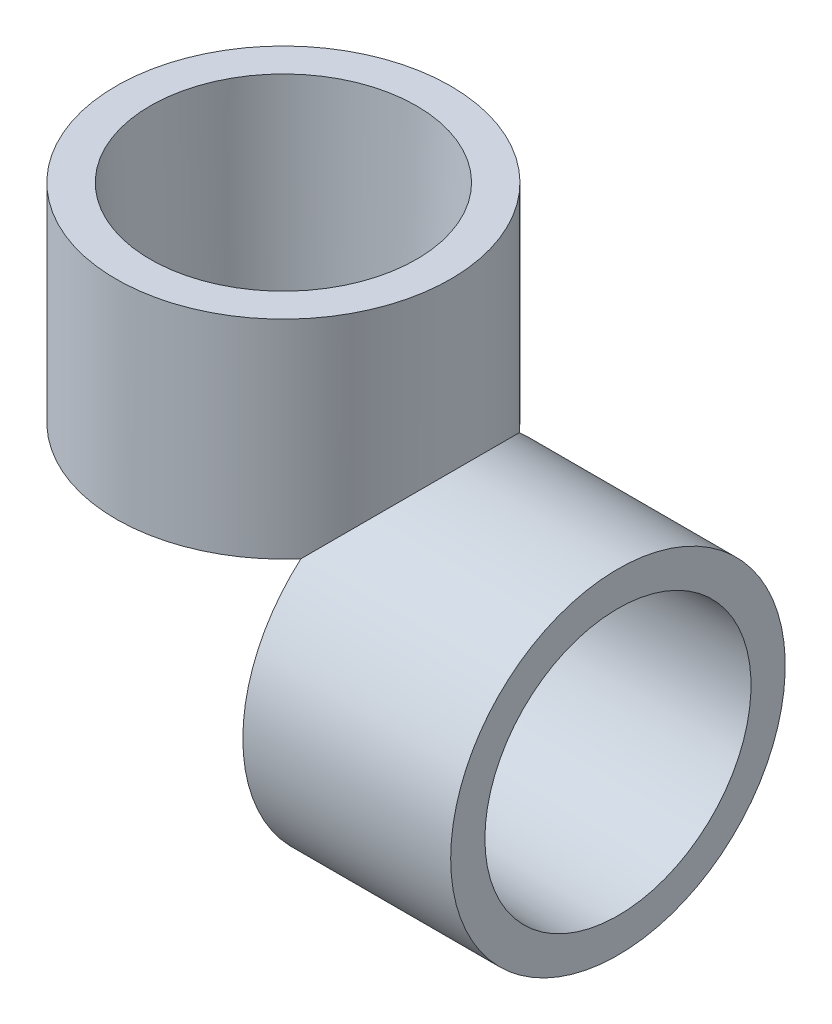
ISO-10303-21;
HEADER;
FILE_DESCRIPTION(('STEP AP214'),'2;1');
FILE_NAME('part.step','',(''),(''),'','','');
FILE_SCHEMA(('AUTOMOTIVE_DESIGN { 1 0 10303 214 1 1 1 1 }'));
ENDSEC;
DATA;
#1=APPLICATION_CONTEXT('core data for automotive mechanical design processes');
#2=APPLICATION_PROTOCOL_DEFINITION('international standard','automotive_design',2000,#1);
#3=PRODUCT_CONTEXT('',#1,'mechanical');
#4=PRODUCT('Part','Part','',(#3));
#5=PRODUCT_RELATED_PRODUCT_CATEGORY('part','',(#4));
#6=PRODUCT_DEFINITION_FORMATION('','',#4);
#7=PRODUCT_DEFINITION_CONTEXT('part definition',#1,'design');
#8=PRODUCT_DEFINITION('design','',#6,#7);
#9=PRODUCT_DEFINITION_SHAPE('','',#8);
#10=(LENGTH_UNIT() NAMED_UNIT(*) SI_UNIT(.MILLI.,.METRE.));
#11=(NAMED_UNIT(*) PLANE_ANGLE_UNIT() SI_UNIT($,.RADIAN.));
#12=(NAMED_UNIT(*) SI_UNIT($,.STERADIAN.) SOLID_ANGLE_UNIT());
#13=UNCERTAINTY_MEASURE_WITH_UNIT(LENGTH_MEASURE(1.E-05),#10,'distance_accuracy_value','');
#14=(GEOMETRIC_REPRESENTATION_CONTEXT(3) GLOBAL_UNCERTAINTY_ASSIGNED_CONTEXT((#13)) GLOBAL_UNIT_ASSIGNED_CONTEXT((#10,
#11,#12)) REPRESENTATION_CONTEXT('',''));
#15=CARTESIAN_POINT('',(0.,0.,0.));
#16=DIRECTION('',(0.,0.,1.));
#17=DIRECTION('',(1.,0.,0.));
#18=AXIS2_PLACEMENT_3D('',#15,#16,#17);
#19=CARTESIAN_POINT('',(-22.4023663910288,0.,0.));
#20=DIRECTION('',(-1.,0.,0.));
#21=DIRECTION('',(0.,0.,1.));
#22=AXIS2_PLACEMENT_3D('',#19,#20,#21);
#23=CYLINDRICAL_SURFACE('',#22,16.764);
#24=CARTESIAN_POINT('',(33.528,0.,0.));
#25=DIRECTION('',(-1.,0.,0.));
#26=DIRECTION('',(0.,0.,1.));
#27=AXIS2_PLACEMENT_3D('',#24,#25,#26);
#28=CIRCLE('',#27,16.764);
#29=CARTESIAN_POINT('',(33.528,0.,16.764));
#30=VERTEX_POINT('',#29);
#31=EDGE_CURVE('E77',#30,#30,#28,.T.);
#32=ORIENTED_EDGE('',*,*,#31,.T.);
#33=EDGE_LOOP('',(#32));
#34=FACE_BOUND('',#33,.T.);
#35=CARTESIAN_POINT('',(12.7,0.,0.));
#36=DIRECTION('',(-1.,0.,0.));
#37=DIRECTION('',(0.,0.,1.));
#38=AXIS2_PLACEMENT_3D('',#35,#36,#37);
#39=CIRCLE('',#38,16.764);
#40=CARTESIAN_POINT('',(12.7,12.7,-10.9426548880973));
#41=VERTEX_POINT('',#40);
#42=CARTESIAN_POINT('',(12.7,12.7,10.9426548880973));
#43=VERTEX_POINT('',#42);
#44=EDGE_CURVE('E132',#41,#43,#39,.T.);
#45=ORIENTED_EDGE('',*,*,#44,.F.);
#46=CARTESIAN_POINT('',(0.,0.,0.));
#47=DIRECTION('',(-0.707106781186547,0.707106781186547,0.));
#48=DIRECTION('',(-0.707106781186547,-0.707106781186547,0.));
#49=AXIS2_PLACEMENT_3D('',#46,#47,#48);
#50=ELLIPSE('',#49,23.7078761596226,16.764);
#51=EDGE_CURVE('E146',#41,#43,#50,.F.);
#52=ORIENTED_EDGE('',*,*,#51,.T.);
#53=EDGE_LOOP('',(#45,#52));
#54=FACE_BOUND('',#53,.T.);
#55=ADVANCED_FACE('F32',(#34,#54),#23,.T.);
#56=CARTESIAN_POINT('',(12.7,-12.6873,0.));
#57=DIRECTION('',(-1.,0.,0.));
#58=DIRECTION('',(0.,0.,1.));
#59=AXIS2_PLACEMENT_3D('',#56,#57,#58);
#60=PLANE('',#59);
#61=CARTESIAN_POINT('',(12.7,0.,0.));
#62=DIRECTION('',(-1.,0.,0.));
#63=DIRECTION('',(0.,0.,1.));
#64=AXIS2_PLACEMENT_3D('',#61,#62,#63);
#65=CIRCLE('',#64,12.6873);
#66=CARTESIAN_POINT('',(12.7,0.,12.6873));
#67=VERTEX_POINT('',#66);
#68=EDGE_CURVE('E135',#67,#67,#65,.T.);
#69=ORIENTED_EDGE('',*,*,#68,.F.);
#70=EDGE_LOOP('',(#69));
#71=FACE_BOUND('',#70,.T.);
#72=ORIENTED_EDGE('',*,*,#44,.T.);
#73=DIRECTION('',(0.,0.,-1.));
#74=VECTOR('',#73,1.);
#75=CARTESIAN_POINT('',(12.7,12.7,0.));
#76=LINE('',#75,#74);
#77=EDGE_CURVE('E151',#43,#41,#76,.T.);
#78=ORIENTED_EDGE('',*,*,#77,.T.);
#79=EDGE_LOOP('',(#72,#78));
#80=FACE_BOUND('',#79,.T.);
#81=ADVANCED_FACE('F113',(#71,#80),#60,.T.);
#82=CARTESIAN_POINT('',(33.528,0.,0.));
#83=DIRECTION('',(1.,0.,0.));
#84=DIRECTION('',(0.,0.,-1.));
#85=AXIS2_PLACEMENT_3D('',#82,#83,#84);
#86=CONICAL_SURFACE('',#85,13.335,0.031087542403291);
#87=ORIENTED_EDGE('',*,*,#68,.T.);
#88=EDGE_LOOP('',(#87));
#89=FACE_BOUND('',#88,.T.);
#90=CARTESIAN_POINT('',(33.528,0.,0.));
#91=DIRECTION('',(-1.,0.,0.));
#92=DIRECTION('',(0.,0.,1.));
#93=AXIS2_PLACEMENT_3D('',#90,#91,#92);
#94=CIRCLE('',#93,13.335);
#95=CARTESIAN_POINT('',(33.528,0.,13.335));
#96=VERTEX_POINT('',#95);
#97=EDGE_CURVE('E139',#96,#96,#94,.T.);
#98=ORIENTED_EDGE('',*,*,#97,.F.);
#99=EDGE_LOOP('',(#98));
#100=FACE_BOUND('',#99,.T.);
#101=CARTESIAN_POINT('',(36.4119498168766,12.7,-4.35110736155428));
#102=CARTESIAN_POINT('',(35.4869876329815,12.7,-4.2622883446657));
#103=CARTESIAN_POINT('',(34.5622353645886,12.7,-4.17119585594103));
#104=CARTESIAN_POINT('',(32.7128828396338,12.7,-3.98309182466522));
#105=CARTESIAN_POINT('',(31.7882828725952,12.7,-3.88607744241561));
#106=CARTESIAN_POINT('',(29.9281599008572,12.7,-3.6835668460444));
#107=CARTESIAN_POINT('',(28.9926468179769,12.7,-3.57797879293136));
#108=CARTESIAN_POINT('',(27.1231461002903,12.7,-3.35726767637652));
#109=CARTESIAN_POINT('',(26.1891579832714,12.7,-3.24214872246008));
#110=CARTESIAN_POINT('',(24.3907261487527,12.7,-3.00779712755191));
#111=CARTESIAN_POINT('',(23.5261659817045,12.7,-2.88947294194463));
#112=CARTESIAN_POINT('',(22.2305364193799,12.7,-2.69993037547669));
#113=CARTESIAN_POINT('',(21.7985931895164,12.7,-2.63469577092611));
#114=CARTESIAN_POINT('',(20.9355339543251,12.7,-2.49923142186171));
#115=CARTESIAN_POINT('',(20.5044178652583,12.7,-2.4290022137415));
#116=CARTESIAN_POINT('',(19.6460160362468,12.7,-2.28263433493216));
#117=CARTESIAN_POINT('',(19.2187234343275,12.7,-2.20653633613802));
#118=CARTESIAN_POINT('',(18.3655486504305,12.7,-2.04585371854661));
#119=CARTESIAN_POINT('',(17.9396671177566,12.7,-1.96126563683796));
#120=CARTESIAN_POINT('',(17.0912420143183,12.7,-1.78029772908474));
#121=CARTESIAN_POINT('',(16.6686933929569,12.7,-1.68394241286468));
#122=CARTESIAN_POINT('',(16.0386443099718,12.7,-1.52497253574196));
#123=CARTESIAN_POINT('',(15.8293243959912,12.7,-1.46959678309565));
#124=CARTESIAN_POINT('',(15.4125515709983,12.7,-1.3522534737481));
#125=CARTESIAN_POINT('',(15.2050982051546,12.7,-1.29028757282811));
#126=CARTESIAN_POINT('',(14.9369960090123,12.7,-1.20332955901974));
#127=CARTESIAN_POINT('',(14.8749273499752,12.7,-1.18271201665464));
#128=CARTESIAN_POINT('',(14.7511361122296,12.7,-1.14044743116969));
#129=CARTESIAN_POINT('',(14.6894135696894,12.7,-1.11880028262002));
#130=CARTESIAN_POINT('',(14.504678205614,12.7,-1.05202946196185));
#131=CARTESIAN_POINT('',(14.3822858899595,12.7,-1.00513645298192));
#132=CARTESIAN_POINT('',(14.1422259598443,12.7,-0.905569599552941));
#133=CARTESIAN_POINT('',(14.0245137814346,12.7,-0.853003147264023));
#134=CARTESIAN_POINT('',(13.7938732415581,12.7,-0.73841814130997));
#135=CARTESIAN_POINT('',(13.6809319339166,12.7,-0.676427590940484));
#136=CARTESIAN_POINT('',(13.5362589556636,12.7,-0.581977230741555));
#137=CARTESIAN_POINT('',(13.4998228222221,12.7,-0.556795984715553));
#138=CARTESIAN_POINT('',(13.4287512423123,12.7,-0.50383787486514));
#139=CARTESIAN_POINT('',(13.3941192447687,12.7,-0.476056304445058));
#140=CARTESIAN_POINT('',(13.3273915976892,12.7,-0.417023344200242));
#141=CARTESIAN_POINT('',(13.2953193665401,12.7,-0.385745087219183));
#142=CARTESIAN_POINT('',(13.2358056125386,12.7,-0.319008165327113));
#143=CARTESIAN_POINT('',(13.2083515627639,12.7,-0.28356126730324));
#144=CARTESIAN_POINT('',(13.1713163837499,12.7,-0.22399198202713));
#145=CARTESIAN_POINT('',(13.1591153854147,12.7,-0.201518029735629));
#146=CARTESIAN_POINT('',(13.138132161061,12.7,-0.155018849679701));
#147=CARTESIAN_POINT('',(13.1293455933276,12.7,-0.13099563756721));
#148=CARTESIAN_POINT('',(13.1160127512181,12.7,-0.0814680324209627));
#149=CARTESIAN_POINT('',(13.1115156879638,12.7,-0.0559499328592697));
#150=CARTESIAN_POINT('',(13.1075837847231,12.7,-0.00452646759036946));
#151=CARTESIAN_POINT('',(13.1081454425923,12.7,0.0213786178053784));
#152=CARTESIAN_POINT('',(13.1138698564803,12.7,0.069571622830897));
#153=CARTESIAN_POINT('',(13.1184866453362,12.7,0.0919281618916124));
#154=CARTESIAN_POINT('',(13.1310862780651,12.7,0.135665878059929));
#155=CARTESIAN_POINT('',(13.1390720351322,12.7,0.157046193238507));
#156=CARTESIAN_POINT('',(13.1630838548623,12.7,0.210397909027754));
#157=CARTESIAN_POINT('',(13.1810987636567,12.7,0.241465537980442));
#158=CARTESIAN_POINT('',(13.2216041551254,12.7,0.300511833169671));
#159=CARTESIAN_POINT('',(13.244107372816,12.7,0.328481349403443));
#160=CARTESIAN_POINT('',(13.3267099599622,12.7,0.420505134575735));
#161=CARTESIAN_POINT('',(13.3939611530006,12.7,0.477995712255375));
#162=CARTESIAN_POINT('',(13.5356388859054,12.7,0.583402087031716));
#163=CARTESIAN_POINT('',(13.6101139552128,12.7,0.631245372814662));
#164=CARTESIAN_POINT('',(13.8283449778996,12.7,0.759068940751675));
#165=CARTESIAN_POINT('',(13.9766022732701,12.7,0.831303461325457));
#166=CARTESIAN_POINT('',(14.2783084051965,12.7,0.964179396031268));
#167=CARTESIAN_POINT('',(14.431770947122,12.7,1.02478686872644));
#168=CARTESIAN_POINT('',(14.7423285879534,12.7,1.13861198112641));
#169=CARTESIAN_POINT('',(14.8994384051288,12.7,1.1917896390742));
#170=CARTESIAN_POINT('',(15.2151265639658,12.7,1.29260869390322));
#171=CARTESIAN_POINT('',(15.3737023873248,12.7,1.34025817006502));
#172=CARTESIAN_POINT('',(15.8562273972202,12.7,1.47863196679619));
#173=CARTESIAN_POINT('',(16.1819739948995,12.7,1.56306823076423));
#174=CARTESIAN_POINT('',(16.8359993531696,12.7,1.72158581378394));
#175=CARTESIAN_POINT('',(17.1642788652043,12.7,1.79566392461234));
#176=CARTESIAN_POINT('',(17.8229955794894,12.7,1.93657707415388));
#177=CARTESIAN_POINT('',(18.1534355890509,12.7,2.00339893418658));
#178=CARTESIAN_POINT('',(18.8153925141558,12.7,2.13150190978114));
#179=CARTESIAN_POINT('',(19.1469094827026,12.7,2.19278274822232));
#180=CARTESIAN_POINT('',(20.1043426268449,12.7,2.36334704586285));
#181=CARTESIAN_POINT('',(20.7312376166871,12.7,2.46713431654162));
#182=CARTESIAN_POINT('',(21.6717065534493,12.7,2.61479479852989));
#183=CARTESIAN_POINT('',(21.9846800758047,12.7,2.66260301369091));
#184=CARTESIAN_POINT('',(22.6109411424883,12.7,2.75595160990196));
#185=CARTESIAN_POINT('',(22.9242286610282,12.7,2.80149216374919));
#186=CARTESIAN_POINT('',(23.2376557544306,12.7,2.84606835182158));
#187=B_SPLINE_CURVE_WITH_KNOTS('',3,(#101,#102,#103,#104,#105,#106,#107,#108,#109,#110,#111,
#112,#113,#114,#115,#116,#117,#118,#119,#120,#121,#122,#123,#124,#125,#126,#127,#128,#129,#130,
#131,#132,#133,#134,#135,#136,#137,#138,#139,#140,#141,#142,#143,#144,#145,#146,#147,#148,#149,
#150,#151,#152,#153,#154,#155,#156,#157,#158,#159,#160,#161,#162,#163,#164,#165,#166,#167,#168,
#169,#170,#171,#172,#173,#174,#175,#176,#177,#178,#179,#180,#181,#182,#183,#184,#185,#186),
.UNSPECIFIED.,.F.,.F.,(4,2,2,2,2,2,2,2,2,2,2,2,2,2,2,2,2,2,2,2,2,2,2,2,2,2,2,2,2,2,2,2,2,2,2,2,
2,2,2,2,2,2,4),(0.,2.78765990624398,5.57666723052451,8.40098710830485,11.2240954780306,
13.8418348394112,15.1523370141792,16.4626986599589,17.764678851804,19.067192266572,
20.3670375389618,21.016537788692,21.6658752346554,21.8620768984161,22.0582986963134,
22.4513347937143,22.8379264892229,23.2233911213346,23.3561848117299,23.4892236868075,
23.6233659677684,23.7571383027465,23.8336418654856,23.9100478271381,23.9873201683945,
24.0645390182493,24.1327240761422,24.200968215857,24.3080829063171,24.4155059593431,
24.6788846958869,24.9441747578654,25.4376073134582,25.9324590708151,26.4298788616317,
26.9265622774611,27.9357642076475,28.9452780280895,29.956595681897,30.967963886346,
32.8740888220415,33.8238969238687,34.7736325386206),.UNSPECIFIED.);
#188=CARTESIAN_POINT('',(16.6792922255259,12.7,-1.68312413550228));
#189=VERTEX_POINT('',#188);
#190=CARTESIAN_POINT('',(16.6792922255259,12.7,1.68312413550226));
#191=VERTEX_POINT('',#190);
#192=EDGE_CURVE('E70',#189,#191,#187,.T.);
#193=ORIENTED_EDGE('',*,*,#192,.T.);
#194=CARTESIAN_POINT('',(16.6791434939418,12.6998,1.68459737281583));
#195=CARTESIAN_POINT('',(16.69324130472,12.7187565292608,1.54503147233998));
#196=CARTESIAN_POINT('',(16.7056140488744,12.7353763623051,1.40498792614338));
#197=CARTESIAN_POINT('',(16.7268585569142,12.7638945904921,1.12415411474194));
#198=CARTESIAN_POINT('',(16.7357302540821,12.7757928956591,0.983363835358818));
#199=CARTESIAN_POINT('',(16.7569139505028,12.804194612544,0.562238255998064));
#200=CARTESIAN_POINT('',(16.764,12.8136804878049,0.28111912799903));
#201=CARTESIAN_POINT('',(16.764,12.8136804878049,-0.281119127999038));
#202=CARTESIAN_POINT('',(16.7569139505028,12.804194612544,-0.562238255998072));
#203=CARTESIAN_POINT('',(16.7357302540821,12.7757928956591,-0.983363835358825));
#204=CARTESIAN_POINT('',(16.7268585569142,12.7638945904921,-1.12415411474195));
#205=CARTESIAN_POINT('',(16.7056140488744,12.7353763623051,-1.40498792614339));
#206=CARTESIAN_POINT('',(16.69324130472,12.7187565292608,-1.54503147233999));
#207=CARTESIAN_POINT('',(16.6791434939418,12.6998,-1.68459737281584));
#208=B_SPLINE_CURVE_WITH_KNOTS('',3,(#194,#195,#196,#197,#198,#199,#200,#201,#202,#203,#204,
#205,#206,#207),.UNSPECIFIED.,.F.,.F.,(4,2,2,2,2,2,4),(0.,0.424594445279593,0.849196981437063,
1.69224786341239,2.53529874538772,2.95990128154519,3.38449572682478),.UNSPECIFIED.);
#209=EDGE_CURVE('E45',#191,#189,#208,.T.);
#210=ORIENTED_EDGE('',*,*,#209,.T.);
#211=EDGE_LOOP('',(#193,#210));
#212=FACE_BOUND('',#211,.T.);
#213=ADVANCED_FACE('F83',(#89,#100,#212),#86,.F.);
#214=CARTESIAN_POINT('',(33.528,-16.764,0.));
#215=DIRECTION('',(1.,0.,0.));
#216=DIRECTION('',(0.,0.,-1.));
#217=AXIS2_PLACEMENT_3D('',#214,#215,#216);
#218=PLANE('',#217);
#219=ORIENTED_EDGE('',*,*,#97,.T.);
#220=EDGE_LOOP('',(#219));
#221=FACE_BOUND('',#220,.T.);
#222=ORIENTED_EDGE('',*,*,#31,.F.);
#223=EDGE_LOOP('',(#222));
#224=FACE_BOUND('',#223,.T.);
#225=ADVANCED_FACE('F34',(#221,#224),#218,.T.);
#226=CARTESIAN_POINT('',(-16.764,12.7,0.));
#227=DIRECTION('',(0.,1.,0.));
#228=DIRECTION('',(0.,0.,1.));
#229=AXIS2_PLACEMENT_3D('',#226,#227,#228);
#230=PLANE('',#229);
#231=ORIENTED_EDGE('',*,*,#192,.F.);
#232=CARTESIAN_POINT('',(0.,12.7,0.));
#233=DIRECTION('',(0.,-1.,0.));
#234=DIRECTION('',(0.,0.,-1.));
#235=AXIS2_PLACEMENT_3D('',#232,#233,#234);
#236=CIRCLE('',#235,16.764);
#237=EDGE_CURVE('E73',#189,#191,#236,.T.);
#238=ORIENTED_EDGE('',*,*,#237,.T.);
#239=EDGE_LOOP('',(#231,#238));
#240=FACE_BOUND('',#239,.T.);
#241=ADVANCED_FACE('F72',(#240),#230,.F.);
#242=CARTESIAN_POINT('',(0.,0.,0.));
#243=DIRECTION('',(0.,-1.,0.));
#244=DIRECTION('',(0.,0.,-1.));
#245=AXIS2_PLACEMENT_3D('',#242,#243,#244);
#246=CYLINDRICAL_SURFACE('',#245,16.764);
#247=ORIENTED_EDGE('',*,*,#209,.F.);
#248=ORIENTED_EDGE('',*,*,#237,.F.);
#249=EDGE_LOOP('',(#247,#248));
#250=FACE_BOUND('',#249,.T.);
#251=ADVANCED_FACE('F80',(#250),#246,.T.);
#252=ORIENTED_EDGE('',*,*,#51,.F.);
#253=EDGE_CURVE('E51',#43,#41,#236,.T.);
#254=ORIENTED_EDGE('',*,*,#253,.F.);
#255=EDGE_LOOP('',(#252,#254));
#256=FACE_BOUND('',#255,.T.);
#257=CARTESIAN_POINT('',(0.,33.528,0.));
#258=DIRECTION('',(0.,-1.,0.));
#259=DIRECTION('',(0.,0.,-1.));
#260=AXIS2_PLACEMENT_3D('',#257,#258,#259);
#261=CIRCLE('',#260,16.764);
#262=CARTESIAN_POINT('',(0.,33.528,-16.764));
#263=VERTEX_POINT('',#262);
#264=EDGE_CURVE('E81',#263,#263,#261,.T.);
#265=ORIENTED_EDGE('',*,*,#264,.T.);
#266=EDGE_LOOP('',(#265));
#267=FACE_BOUND('',#266,.T.);
#268=ADVANCED_FACE('F98',(#256,#267),#246,.T.);
#269=ORIENTED_EDGE('',*,*,#77,.F.);
#270=ORIENTED_EDGE('',*,*,#253,.T.);
#271=EDGE_LOOP('',(#269,#270));
#272=FACE_BOUND('',#271,.T.);
#273=CARTESIAN_POINT('',(0.,12.7,0.));
#274=DIRECTION('',(0.,-1.,0.));
#275=DIRECTION('',(0.,0.,-1.));
#276=AXIS2_PLACEMENT_3D('',#273,#274,#275);
#277=CIRCLE('',#276,12.6873);
#278=CARTESIAN_POINT('',(0.,12.7,-12.6873));
#279=VERTEX_POINT('',#278);
#280=EDGE_CURVE('E156',#279,#279,#277,.T.);
#281=ORIENTED_EDGE('',*,*,#280,.F.);
#282=EDGE_LOOP('',(#281));
#283=FACE_BOUND('',#282,.T.);
#284=ADVANCED_FACE('F103',(#272,#283),#230,.F.);
#285=CARTESIAN_POINT('',(-13.335,33.528,0.));
#286=DIRECTION('',(0.,-1.,0.));
#287=DIRECTION('',(0.,0.,-1.));
#288=AXIS2_PLACEMENT_3D('',#285,#286,#287);
#289=PLANE('',#288);
#290=ORIENTED_EDGE('',*,*,#264,.F.);
#291=EDGE_LOOP('',(#290));
#292=FACE_BOUND('',#291,.T.);
#293=CARTESIAN_POINT('',(0.,33.528,0.));
#294=DIRECTION('',(0.,-1.,0.));
#295=DIRECTION('',(0.,0.,-1.));
#296=AXIS2_PLACEMENT_3D('',#293,#294,#295);
#297=CIRCLE('',#296,13.335);
#298=CARTESIAN_POINT('',(0.,33.528,-13.335));
#299=VERTEX_POINT('',#298);
#300=EDGE_CURVE('E159',#299,#299,#297,.T.);
#301=ORIENTED_EDGE('',*,*,#300,.T.);
#302=EDGE_LOOP('',(#301));
#303=FACE_BOUND('',#302,.T.);
#304=ADVANCED_FACE('F100',(#292,#303),#289,.F.);
#305=CARTESIAN_POINT('',(0.,12.7,0.));
#306=DIRECTION('',(0.,1.,0.));
#307=DIRECTION('',(0.,0.,1.));
#308=AXIS2_PLACEMENT_3D('',#305,#306,#307);
#309=CONICAL_SURFACE('',#308,12.6873,0.0310875424032909);
#310=CARTESIAN_POINT('',(12.6998,16.6791434939418,1.68459737281581));
#311=CARTESIAN_POINT('',(12.7187565292608,16.69324130472,1.54503147233996));
#312=CARTESIAN_POINT('',(12.7353763623051,16.7056140488744,1.40498792614336));
#313=CARTESIAN_POINT('',(12.7638945904921,16.7268585569142,1.12415411474193));
#314=CARTESIAN_POINT('',(12.7757928956591,16.7357302540821,0.983363835358804));
#315=CARTESIAN_POINT('',(12.804194612544,16.7569139505028,0.562238255998056));
#316=CARTESIAN_POINT('',(12.8136804878049,16.764,0.281119127999024));
#317=CARTESIAN_POINT('',(12.8136804878049,16.764,-0.281119127999037));
#318=CARTESIAN_POINT('',(12.804194612544,16.7569139505028,-0.562238255998068));
#319=CARTESIAN_POINT('',(12.7757928956591,16.7357302540821,-0.983363835358817));
#320=CARTESIAN_POINT('',(12.7638945904921,16.7268585569142,-1.12415411474194));
#321=CARTESIAN_POINT('',(12.7353763623051,16.7056140488744,-1.40498792614338));
#322=CARTESIAN_POINT('',(12.7187565292608,16.69324130472,-1.54503147233997));
#323=CARTESIAN_POINT('',(12.6998,16.6791434939418,-1.68459737281582));
#324=B_SPLINE_CURVE_WITH_KNOTS('',3,(#310,#311,#312,#313,#314,#315,#316,#317,#318,#319,#320,
#321,#322,#323),.UNSPECIFIED.,.F.,.F.,(4,2,2,2,2,2,4),(0.,0.424594445279588,0.849196981437053,
1.69224786341237,2.53529874538769,2.95990128154515,3.38449572682474),.UNSPECIFIED.);
#325=CARTESIAN_POINT('',(12.7,16.6792922255259,1.68312413550227));
#326=VERTEX_POINT('',#325);
#327=CARTESIAN_POINT('',(12.7,16.6792922255259,-1.68312413550227));
#328=VERTEX_POINT('',#327);
#329=EDGE_CURVE('E58',#326,#328,#324,.T.);
#330=ORIENTED_EDGE('',*,*,#329,.F.);
#331=CARTESIAN_POINT('',(12.7,36.4119498168765,-4.35110736155427));
#332=CARTESIAN_POINT('',(12.7,35.4869876329813,-4.26228834466567));
#333=CARTESIAN_POINT('',(12.7,34.5622353645883,-4.171195855941));
#334=CARTESIAN_POINT('',(12.7,32.7128828396333,-3.98309182466517));
#335=CARTESIAN_POINT('',(12.7,31.7882828725945,-3.88607744241555));
#336=CARTESIAN_POINT('',(12.7,29.9281599008563,-3.6835668460443));
#337=CARTESIAN_POINT('',(12.7,28.9926468179759,-3.57797879293123));
#338=CARTESIAN_POINT('',(12.7,27.123146100289,-3.35726767637636));
#339=CARTESIAN_POINT('',(12.7,26.1891579832701,-3.24214872245991));
#340=CARTESIAN_POINT('',(12.7,24.3907261487513,-3.00779712755173));
#341=CARTESIAN_POINT('',(12.7,23.5261659817032,-2.88947294194445));
#342=CARTESIAN_POINT('',(12.7,22.2305364193788,-2.69993037547652));
#343=CARTESIAN_POINT('',(12.7,21.7985931895154,-2.63469577092595));
#344=CARTESIAN_POINT('',(12.7,20.9355339543242,-2.49923142186156));
#345=CARTESIAN_POINT('',(12.7,20.5044178652575,-2.42900221374136));
#346=CARTESIAN_POINT('',(12.7,19.6460160362462,-2.28263433493203));
#347=CARTESIAN_POINT('',(12.7,19.2187234343269,-2.2065363361379));
#348=CARTESIAN_POINT('',(12.7,18.36554865043,-2.04585371854651));
#349=CARTESIAN_POINT('',(12.7,17.9396671177561,-1.96126563683786));
#350=CARTESIAN_POINT('',(12.7,17.091242014318,-1.78029772908466));
#351=CARTESIAN_POINT('',(12.7,16.6686933929566,-1.68394241286461));
#352=CARTESIAN_POINT('',(12.7,16.0386443099716,-1.52497253574193));
#353=CARTESIAN_POINT('',(12.7,15.8293243959911,-1.46959678309563));
#354=CARTESIAN_POINT('',(12.7,15.4125515709983,-1.35225347374809));
#355=CARTESIAN_POINT('',(12.7,15.2050982051546,-1.29028757282808));
#356=CARTESIAN_POINT('',(12.7,14.9369960090123,-1.20332955901974));
#357=CARTESIAN_POINT('',(12.7,14.8749273499752,-1.18271201665465));
#358=CARTESIAN_POINT('',(12.7,14.7511361122296,-1.1404474311697));
#359=CARTESIAN_POINT('',(12.7,14.6894135696894,-1.11880028262001));
#360=CARTESIAN_POINT('',(12.7,14.504678205614,-1.05202946196183));
#361=CARTESIAN_POINT('',(12.7,14.3822858899596,-1.0051364529819));
#362=CARTESIAN_POINT('',(12.7,14.1422259598443,-0.905569599552954));
#363=CARTESIAN_POINT('',(12.7,14.0245137814346,-0.853003147264044));
#364=CARTESIAN_POINT('',(12.7,13.7938732415581,-0.738418141309982));
#365=CARTESIAN_POINT('',(12.7,13.6809319339166,-0.676427590940477));
#366=CARTESIAN_POINT('',(12.7,13.5362589556636,-0.581977230741548));
#367=CARTESIAN_POINT('',(12.7,13.4998228222221,-0.556795984715549));
#368=CARTESIAN_POINT('',(12.7,13.4287512423123,-0.503837874865149));
#369=CARTESIAN_POINT('',(12.7,13.3941192447687,-0.476056304445077));
#370=CARTESIAN_POINT('',(12.7,13.3273915976892,-0.417023344200251));
#371=CARTESIAN_POINT('',(12.7,13.2953193665402,-0.385745087219171));
#372=CARTESIAN_POINT('',(12.7,13.2358056125386,-0.319008165327095));
#373=CARTESIAN_POINT('',(12.7,13.208351562764,-0.283561267303236));
#374=CARTESIAN_POINT('',(12.7,13.1713163837499,-0.223991982027135));
#375=CARTESIAN_POINT('',(12.7,13.1591153854147,-0.201518029735634));
#376=CARTESIAN_POINT('',(12.7,13.138132161061,-0.155018849679707));
#377=CARTESIAN_POINT('',(12.7,13.1293455933276,-0.130995637567216));
#378=CARTESIAN_POINT('',(12.7,13.1160127512181,-0.0814680324209683));
#379=CARTESIAN_POINT('',(12.7,13.1115156879638,-0.0559499328592744));
#380=CARTESIAN_POINT('',(12.7,13.1075837847231,-0.00452646759037215));
#381=CARTESIAN_POINT('',(12.7,13.1081454425923,0.0213786178053768));
#382=CARTESIAN_POINT('',(12.7,13.1138698564803,0.0695716228308972));
#383=CARTESIAN_POINT('',(12.7,13.1184866453362,0.0919281618916131));
#384=CARTESIAN_POINT('',(12.7,13.1310862780651,0.135665878059929));
#385=CARTESIAN_POINT('',(12.7,13.1390720351322,0.157046193238506));
#386=CARTESIAN_POINT('',(12.7,13.1630838548624,0.210397909027751));
#387=CARTESIAN_POINT('',(12.7,13.1810987636567,0.24146553798044));
#388=CARTESIAN_POINT('',(12.7,13.2216041551254,0.300511833169669));
#389=CARTESIAN_POINT('',(12.7,13.244107372816,0.328481349403441));
#390=CARTESIAN_POINT('',(12.7,13.3267099599622,0.420505134575733));
#391=CARTESIAN_POINT('',(12.7,13.3939611530006,0.477995712255376));
#392=CARTESIAN_POINT('',(12.7,13.5356388859054,0.583402087031719));
#393=CARTESIAN_POINT('',(12.7,13.6101139552128,0.631245372814664));
#394=CARTESIAN_POINT('',(12.7,13.8283449778996,0.759068940751672));
#395=CARTESIAN_POINT('',(12.7,13.9766022732701,0.831303461325448));
#396=CARTESIAN_POINT('',(12.7,14.2783084051965,0.964179396031254));
#397=CARTESIAN_POINT('',(12.7,14.431770947122,1.02478686872643));
#398=CARTESIAN_POINT('',(12.7,14.7423285879533,1.1386119811264));
#399=CARTESIAN_POINT('',(12.7,14.8994384051288,1.19178963907419));
#400=CARTESIAN_POINT('',(12.7,15.2151265639658,1.29260869390322));
#401=CARTESIAN_POINT('',(12.7,15.3737023873248,1.34025817006502));
#402=CARTESIAN_POINT('',(12.7,15.8562273972202,1.47863196679618));
#403=CARTESIAN_POINT('',(12.7,16.1819739948995,1.56306823076421));
#404=CARTESIAN_POINT('',(12.7,16.8359993531696,1.72158581378391));
#405=CARTESIAN_POINT('',(12.7,17.1642788652043,1.79566392461233));
#406=CARTESIAN_POINT('',(12.7,17.8229955794894,1.93657707415388));
#407=CARTESIAN_POINT('',(12.7,18.1534355890509,2.00339893418657));
#408=CARTESIAN_POINT('',(12.7,18.8153925141558,2.13150190978112));
#409=CARTESIAN_POINT('',(12.7,19.1469094827025,2.19278274822231));
#410=CARTESIAN_POINT('',(12.7,20.1043426268448,2.36334704586285));
#411=CARTESIAN_POINT('',(12.7,20.7312376166871,2.46713431654162));
#412=CARTESIAN_POINT('',(12.7,21.6717065534492,2.61479479852988));
#413=CARTESIAN_POINT('',(12.7,21.9846800758047,2.66260301369089));
#414=CARTESIAN_POINT('',(12.7,22.6109411424882,2.75595160990194));
#415=CARTESIAN_POINT('',(12.7,22.9242286610281,2.80149216374917));
#416=CARTESIAN_POINT('',(12.7,23.2376557544305,2.84606835182157));
#417=B_SPLINE_CURVE_WITH_KNOTS('',3,(#331,#332,#333,#334,#335,#336,#337,#338,#339,#340,#341,
#342,#343,#344,#345,#346,#347,#348,#349,#350,#351,#352,#353,#354,#355,#356,#357,#358,#359,#360,
#361,#362,#363,#364,#365,#366,#367,#368,#369,#370,#371,#372,#373,#374,#375,#376,#377,#378,#379,
#380,#381,#382,#383,#384,#385,#386,#387,#388,#389,#390,#391,#392,#393,#394,#395,#396,#397,#398,
#399,#400,#401,#402,#403,#404,#405,#406,#407,#408,#409,#410,#411,#412,#413,#414,#415,#416),
.UNSPECIFIED.,.F.,.F.,(4,2,2,2,2,2,2,2,2,2,2,2,2,2,2,2,2,2,2,2,2,2,2,2,2,2,2,2,2,2,2,2,2,2,2,2,
2,2,2,2,2,2,4),(0.,2.78765990624431,5.57666723052519,8.40098710830589,11.224095478032,
13.8418348394123,15.1523370141801,16.4626986599595,17.7646788518045,19.0671922665723,
20.3670375389619,21.016537788692,21.6658752346553,21.862076898416,22.0582986963133,
22.4513347937141,22.8379264892227,23.2233911213345,23.3561848117298,23.4892236868074,
23.6233659677682,23.7571383027464,23.8336418654854,23.910047827138,23.9873201683944,
24.0645390182492,24.1327240761421,24.2009682158569,24.308082906317,24.415505959343,
24.6788846958868,24.9441747578653,25.4376073134581,25.932459070815,26.4298788616316,
26.926562277461,27.9357642076474,28.9452780280894,29.9565956818969,30.9679638863458,
32.8740888220413,33.8238969238685,34.7736325386203),.UNSPECIFIED.);
#418=EDGE_CURVE('E11',#328,#326,#417,.T.);
#419=ORIENTED_EDGE('',*,*,#418,.F.);
#420=EDGE_LOOP('',(#330,#419));
#421=FACE_BOUND('',#420,.T.);
#422=ORIENTED_EDGE('',*,*,#300,.F.);
#423=EDGE_LOOP('',(#422));
#424=FACE_BOUND('',#423,.T.);
#425=ORIENTED_EDGE('',*,*,#280,.T.);
#426=EDGE_LOOP('',(#425));
#427=FACE_BOUND('',#426,.T.);
#428=ADVANCED_FACE('F102',(#421,#424,#427),#309,.F.);
#429=EDGE_CURVE('E131',#326,#328,#39,.T.);
#430=ORIENTED_EDGE('',*,*,#429,.T.);
#431=ORIENTED_EDGE('',*,*,#418,.T.);
#432=EDGE_LOOP('',(#430,#431));
#433=FACE_BOUND('',#432,.T.);
#434=ADVANCED_FACE('F109',(#433),#60,.T.);
#435=ORIENTED_EDGE('',*,*,#429,.F.);
#436=ORIENTED_EDGE('',*,*,#329,.T.);
#437=EDGE_LOOP('',(#435,#436));
#438=FACE_BOUND('',#437,.T.);
#439=ADVANCED_FACE('F115',(#438),#23,.T.);
#440=CLOSED_SHELL('',(#55,#81,#213,#225,#241,#251,#268,#284,#304,#428,#434,#439));
#441=MANIFOLD_SOLID_BREP('B2',#440);
#442=ADVANCED_BREP_SHAPE_REPRESENTATION('',(#18,#441),#14);
#443=SHAPE_DEFINITION_REPRESENTATION(#9,#442);
ENDSEC;
END-ISO-10303-21;
